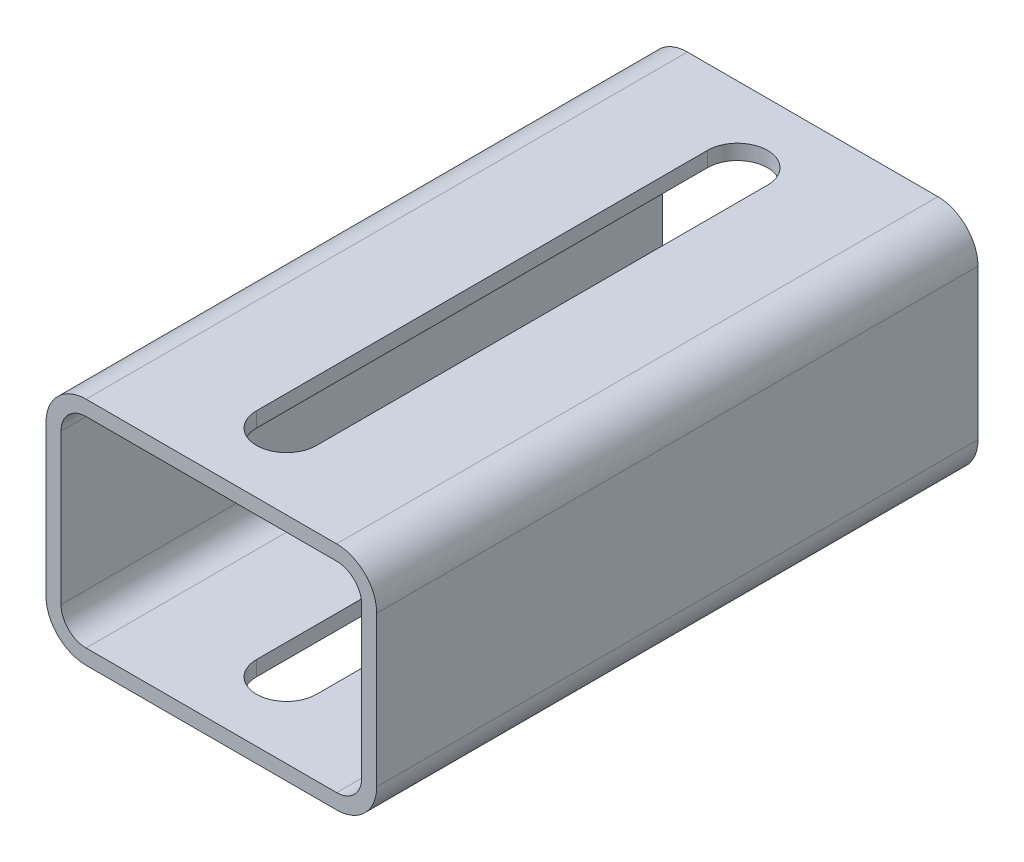
ISO-10303-21;
HEADER;
FILE_DESCRIPTION(('STEP AP214'),'2;1');
FILE_NAME('part.step','',(''),(''),'','','');
FILE_SCHEMA(('AUTOMOTIVE_DESIGN { 1 0 10303 214 1 1 1 1 }'));
ENDSEC;
DATA;
#1=APPLICATION_CONTEXT('core data for automotive mechanical design processes');
#2=APPLICATION_PROTOCOL_DEFINITION('international standard','automotive_design',2000,#1);
#3=PRODUCT_CONTEXT('',#1,'mechanical');
#4=PRODUCT('Part','Part','',(#3));
#5=PRODUCT_RELATED_PRODUCT_CATEGORY('part','',(#4));
#6=PRODUCT_DEFINITION_FORMATION('','',#4);
#7=PRODUCT_DEFINITION_CONTEXT('part definition',#1,'design');
#8=PRODUCT_DEFINITION('design','',#6,#7);
#9=PRODUCT_DEFINITION_SHAPE('','',#8);
#10=(LENGTH_UNIT() NAMED_UNIT(*) SI_UNIT(.MILLI.,.METRE.));
#11=(NAMED_UNIT(*) PLANE_ANGLE_UNIT() SI_UNIT($,.RADIAN.));
#12=(NAMED_UNIT(*) SI_UNIT($,.STERADIAN.) SOLID_ANGLE_UNIT());
#13=UNCERTAINTY_MEASURE_WITH_UNIT(LENGTH_MEASURE(1.E-05),#10,'distance_accuracy_value','');
#14=(GEOMETRIC_REPRESENTATION_CONTEXT(3) GLOBAL_UNCERTAINTY_ASSIGNED_CONTEXT((#13)) GLOBAL_UNIT_ASSIGNED_CONTEXT((#10,
#11,#12)) REPRESENTATION_CONTEXT('',''));
#15=CARTESIAN_POINT('',(0.,0.,0.));
#16=DIRECTION('',(0.,0.,1.));
#17=DIRECTION('',(1.,0.,0.));
#18=AXIS2_PLACEMENT_3D('',#15,#16,#17);
#19=CARTESIAN_POINT('',(25.,15.,60.));
#20=DIRECTION('',(0.,0.,-1.));
#21=DIRECTION('',(-1.,0.,0.));
#22=AXIS2_PLACEMENT_3D('',#19,#20,#21);
#23=PLANE('',#22);
#24=CARTESIAN_POINT('',(25.,15.,60.));
#25=DIRECTION('',(0.,0.,-1.));
#26=DIRECTION('',(-1.,0.,0.));
#27=AXIS2_PLACEMENT_3D('',#24,#25,#26);
#28=CIRCLE('',#27,8.);
#29=CARTESIAN_POINT('',(33.,15.,60.));
#30=VERTEX_POINT('',#29);
#31=CARTESIAN_POINT('',(25.,23.,60.));
#32=VERTEX_POINT('',#31);
#33=EDGE_CURVE('E404',#30,#32,#28,.F.);
#34=ORIENTED_EDGE('',*,*,#33,.T.);
#35=DIRECTION('',(-1.,0.,0.));
#36=VECTOR('',#35,1.);
#37=CARTESIAN_POINT('',(25.,23.,60.));
#38=LINE('',#37,#36);
#39=CARTESIAN_POINT('',(-25.,23.,60.));
#40=VERTEX_POINT('',#39);
#41=EDGE_CURVE('E408',#32,#40,#38,.T.);
#42=ORIENTED_EDGE('',*,*,#41,.T.);
#43=CARTESIAN_POINT('',(-25.,15.,60.));
#44=DIRECTION('',(0.,0.,-1.));
#45=DIRECTION('',(-1.,0.,0.));
#46=AXIS2_PLACEMENT_3D('',#43,#44,#45);
#47=CIRCLE('',#46,8.);
#48=CARTESIAN_POINT('',(-33.,14.9999999999999,60.));
#49=VERTEX_POINT('',#48);
#50=EDGE_CURVE('E412',#40,#49,#47,.F.);
#51=ORIENTED_EDGE('',*,*,#50,.T.);
#52=DIRECTION('',(0.,-1.,0.));
#53=VECTOR('',#52,1.);
#54=CARTESIAN_POINT('',(-33.,15.,60.));
#55=LINE('',#54,#53);
#56=CARTESIAN_POINT('',(-33.,-15.,60.));
#57=VERTEX_POINT('',#56);
#58=EDGE_CURVE('E415',#49,#57,#55,.T.);
#59=ORIENTED_EDGE('',*,*,#58,.T.);
#60=CARTESIAN_POINT('',(-25.,-15.,60.));
#61=DIRECTION('',(0.,0.,-1.));
#62=DIRECTION('',(-1.,0.,0.));
#63=AXIS2_PLACEMENT_3D('',#60,#61,#62);
#64=CIRCLE('',#63,8.);
#65=CARTESIAN_POINT('',(-24.9999999999999,-23.,60.));
#66=VERTEX_POINT('',#65);
#67=EDGE_CURVE('E418',#57,#66,#64,.F.);
#68=ORIENTED_EDGE('',*,*,#67,.T.);
#69=DIRECTION('',(1.,0.,0.));
#70=VECTOR('',#69,1.);
#71=CARTESIAN_POINT('',(25.,-23.,60.));
#72=LINE('',#71,#70);
#73=CARTESIAN_POINT('',(25.,-23.,60.));
#74=VERTEX_POINT('',#73);
#75=EDGE_CURVE('E421',#66,#74,#72,.T.);
#76=ORIENTED_EDGE('',*,*,#75,.T.);
#77=CARTESIAN_POINT('',(25.,-15.,60.));
#78=DIRECTION('',(0.,0.,-1.));
#79=DIRECTION('',(-1.,0.,0.));
#80=AXIS2_PLACEMENT_3D('',#77,#78,#79);
#81=CIRCLE('',#80,8.);
#82=CARTESIAN_POINT('',(33.,-15.,60.));
#83=VERTEX_POINT('',#82);
#84=EDGE_CURVE('E424',#74,#83,#81,.F.);
#85=ORIENTED_EDGE('',*,*,#84,.T.);
#86=DIRECTION('',(0.,1.,0.));
#87=VECTOR('',#86,1.);
#88=CARTESIAN_POINT('',(33.,15.,60.));
#89=LINE('',#88,#87);
#90=EDGE_CURVE('E427',#83,#30,#89,.T.);
#91=ORIENTED_EDGE('',*,*,#90,.T.);
#92=EDGE_LOOP('',(#34,#42,#51,#59,#68,#76,#85,#91));
#93=FACE_BOUND('',#92,.T.);
#94=CARTESIAN_POINT('',(25.,15.,60.));
#95=DIRECTION('',(0.,0.,1.));
#96=DIRECTION('',(-1.,0.,0.));
#97=AXIS2_PLACEMENT_3D('',#94,#95,#96);
#98=CIRCLE('',#97,5.);
#99=CARTESIAN_POINT('',(30.,15.,60.));
#100=VERTEX_POINT('',#99);
#101=CARTESIAN_POINT('',(25.,20.,60.));
#102=VERTEX_POINT('',#101);
#103=EDGE_CURVE('E321',#100,#102,#98,.T.);
#104=ORIENTED_EDGE('',*,*,#103,.F.);
#105=DIRECTION('',(0.,1.,0.));
#106=VECTOR('',#105,1.);
#107=CARTESIAN_POINT('',(30.,-15.,60.));
#108=LINE('',#107,#106);
#109=CARTESIAN_POINT('',(30.,-15.,60.));
#110=VERTEX_POINT('',#109);
#111=EDGE_CURVE('E344',#110,#100,#108,.T.);
#112=ORIENTED_EDGE('',*,*,#111,.F.);
#113=CARTESIAN_POINT('',(25.,-15.,60.));
#114=DIRECTION('',(0.,0.,1.));
#115=DIRECTION('',(1.,0.,0.));
#116=AXIS2_PLACEMENT_3D('',#113,#114,#115);
#117=CIRCLE('',#116,5.);
#118=CARTESIAN_POINT('',(25.,-20.,60.));
#119=VERTEX_POINT('',#118);
#120=EDGE_CURVE('E340',#119,#110,#117,.T.);
#121=ORIENTED_EDGE('',*,*,#120,.F.);
#122=DIRECTION('',(1.,0.,0.));
#123=VECTOR('',#122,1.);
#124=CARTESIAN_POINT('',(-25.,-20.,60.));
#125=LINE('',#124,#123);
#126=CARTESIAN_POINT('',(-25.,-20.,60.));
#127=VERTEX_POINT('',#126);
#128=EDGE_CURVE('E337',#127,#119,#125,.T.);
#129=ORIENTED_EDGE('',*,*,#128,.F.);
#130=CARTESIAN_POINT('',(-25.,-15.,60.));
#131=DIRECTION('',(0.,0.,1.));
#132=DIRECTION('',(-1.,0.,0.));
#133=AXIS2_PLACEMENT_3D('',#130,#131,#132);
#134=CIRCLE('',#133,5.);
#135=CARTESIAN_POINT('',(-30.,-15.,60.));
#136=VERTEX_POINT('',#135);
#137=EDGE_CURVE('E334',#136,#127,#134,.T.);
#138=ORIENTED_EDGE('',*,*,#137,.F.);
#139=DIRECTION('',(0.,-1.,0.));
#140=VECTOR('',#139,1.);
#141=CARTESIAN_POINT('',(-30.,-15.,60.));
#142=LINE('',#141,#140);
#143=CARTESIAN_POINT('',(-30.,15.,60.));
#144=VERTEX_POINT('',#143);
#145=EDGE_CURVE('E331',#144,#136,#142,.T.);
#146=ORIENTED_EDGE('',*,*,#145,.F.);
#147=CARTESIAN_POINT('',(-25.,15.,60.));
#148=DIRECTION('',(0.,0.,1.));
#149=DIRECTION('',(-1.,0.,0.));
#150=AXIS2_PLACEMENT_3D('',#147,#148,#149);
#151=CIRCLE('',#150,5.);
#152=CARTESIAN_POINT('',(-25.,20.,60.));
#153=VERTEX_POINT('',#152);
#154=EDGE_CURVE('E328',#153,#144,#151,.T.);
#155=ORIENTED_EDGE('',*,*,#154,.F.);
#156=DIRECTION('',(-1.,0.,0.));
#157=VECTOR('',#156,1.);
#158=CARTESIAN_POINT('',(-25.,20.,60.));
#159=LINE('',#158,#157);
#160=EDGE_CURVE('E324',#102,#153,#159,.T.);
#161=ORIENTED_EDGE('',*,*,#160,.F.);
#162=EDGE_LOOP('',(#104,#112,#121,#129,#138,#146,#155,#161));
#163=FACE_BOUND('',#162,.T.);
#164=ADVANCED_FACE('F87',(#93,#163),#23,.F.);
#165=CARTESIAN_POINT('',(25.,15.,-60.));
#166=DIRECTION('',(0.,0.,-1.));
#167=DIRECTION('',(-1.,0.,0.));
#168=AXIS2_PLACEMENT_3D('',#165,#166,#167);
#169=PLANE('',#168);
#170=CARTESIAN_POINT('',(25.,15.,-60.));
#171=DIRECTION('',(0.,0.,-1.));
#172=DIRECTION('',(-1.,0.,0.));
#173=AXIS2_PLACEMENT_3D('',#170,#171,#172);
#174=CIRCLE('',#173,8.);
#175=CARTESIAN_POINT('',(33.,15.,-60.));
#176=VERTEX_POINT('',#175);
#177=CARTESIAN_POINT('',(25.,23.,-60.));
#178=VERTEX_POINT('',#177);
#179=EDGE_CURVE('E403',#176,#178,#174,.F.);
#180=ORIENTED_EDGE('',*,*,#179,.F.);
#181=DIRECTION('',(0.,1.,0.));
#182=VECTOR('',#181,1.);
#183=CARTESIAN_POINT('',(33.,15.,-60.));
#184=LINE('',#183,#182);
#185=CARTESIAN_POINT('',(33.,-15.,-60.));
#186=VERTEX_POINT('',#185);
#187=EDGE_CURVE('E409',#186,#176,#184,.T.);
#188=ORIENTED_EDGE('',*,*,#187,.F.);
#189=CARTESIAN_POINT('',(25.,-15.,-60.));
#190=DIRECTION('',(0.,0.,-1.));
#191=DIRECTION('',(-1.,0.,0.));
#192=AXIS2_PLACEMENT_3D('',#189,#190,#191);
#193=CIRCLE('',#192,8.);
#194=CARTESIAN_POINT('',(25.,-23.,-60.));
#195=VERTEX_POINT('',#194);
#196=EDGE_CURVE('E449',#195,#186,#193,.F.);
#197=ORIENTED_EDGE('',*,*,#196,.F.);
#198=DIRECTION('',(1.,0.,0.));
#199=VECTOR('',#198,1.);
#200=CARTESIAN_POINT('',(25.,-23.,-60.));
#201=LINE('',#200,#199);
#202=CARTESIAN_POINT('',(-24.9999999999999,-23.,-60.));
#203=VERTEX_POINT('',#202);
#204=EDGE_CURVE('E446',#203,#195,#201,.T.);
#205=ORIENTED_EDGE('',*,*,#204,.F.);
#206=CARTESIAN_POINT('',(-25.,-15.,-60.));
#207=DIRECTION('',(0.,0.,-1.));
#208=DIRECTION('',(-1.,0.,0.));
#209=AXIS2_PLACEMENT_3D('',#206,#207,#208);
#210=CIRCLE('',#209,8.);
#211=CARTESIAN_POINT('',(-33.,-15.,-60.));
#212=VERTEX_POINT('',#211);
#213=EDGE_CURVE('E443',#212,#203,#210,.F.);
#214=ORIENTED_EDGE('',*,*,#213,.F.);
#215=DIRECTION('',(0.,-1.,0.));
#216=VECTOR('',#215,1.);
#217=CARTESIAN_POINT('',(-33.,15.,-60.));
#218=LINE('',#217,#216);
#219=CARTESIAN_POINT('',(-33.,14.9999999999999,-60.));
#220=VERTEX_POINT('',#219);
#221=EDGE_CURVE('E440',#220,#212,#218,.T.);
#222=ORIENTED_EDGE('',*,*,#221,.F.);
#223=CARTESIAN_POINT('',(-25.,15.,-60.));
#224=DIRECTION('',(0.,0.,-1.));
#225=DIRECTION('',(-1.,0.,0.));
#226=AXIS2_PLACEMENT_3D('',#223,#224,#225);
#227=CIRCLE('',#226,8.);
#228=CARTESIAN_POINT('',(-25.,23.,-60.));
#229=VERTEX_POINT('',#228);
#230=EDGE_CURVE('E437',#229,#220,#227,.F.);
#231=ORIENTED_EDGE('',*,*,#230,.F.);
#232=DIRECTION('',(-1.,0.,0.));
#233=VECTOR('',#232,1.);
#234=CARTESIAN_POINT('',(25.,23.,-60.));
#235=LINE('',#234,#233);
#236=EDGE_CURVE('E434',#178,#229,#235,.T.);
#237=ORIENTED_EDGE('',*,*,#236,.F.);
#238=EDGE_LOOP('',(#180,#188,#197,#205,#214,#222,#231,#237));
#239=FACE_BOUND('',#238,.T.);
#240=DIRECTION('',(0.,1.,0.));
#241=VECTOR('',#240,1.);
#242=CARTESIAN_POINT('',(30.,-15.,-60.));
#243=LINE('',#242,#241);
#244=CARTESIAN_POINT('',(30.,-15.,-60.));
#245=VERTEX_POINT('',#244);
#246=CARTESIAN_POINT('',(30.,15.,-60.));
#247=VERTEX_POINT('',#246);
#248=EDGE_CURVE('E325',#245,#247,#243,.T.);
#249=ORIENTED_EDGE('',*,*,#248,.T.);
#250=CARTESIAN_POINT('',(25.,15.,-60.));
#251=DIRECTION('',(0.,0.,1.));
#252=DIRECTION('',(-1.,0.,0.));
#253=AXIS2_PLACEMENT_3D('',#250,#251,#252);
#254=CIRCLE('',#253,5.);
#255=CARTESIAN_POINT('',(25.,20.,-60.));
#256=VERTEX_POINT('',#255);
#257=EDGE_CURVE('E320',#247,#256,#254,.T.);
#258=ORIENTED_EDGE('',*,*,#257,.T.);
#259=DIRECTION('',(-1.,0.,0.));
#260=VECTOR('',#259,1.);
#261=CARTESIAN_POINT('',(-25.,20.,-60.));
#262=LINE('',#261,#260);
#263=CARTESIAN_POINT('',(-25.,20.,-60.));
#264=VERTEX_POINT('',#263);
#265=EDGE_CURVE('E351',#256,#264,#262,.T.);
#266=ORIENTED_EDGE('',*,*,#265,.T.);
#267=CARTESIAN_POINT('',(-25.,15.,-60.));
#268=DIRECTION('',(0.,0.,1.));
#269=DIRECTION('',(-1.,0.,0.));
#270=AXIS2_PLACEMENT_3D('',#267,#268,#269);
#271=CIRCLE('',#270,5.);
#272=CARTESIAN_POINT('',(-30.,15.,-60.));
#273=VERTEX_POINT('',#272);
#274=EDGE_CURVE('E355',#264,#273,#271,.T.);
#275=ORIENTED_EDGE('',*,*,#274,.T.);
#276=DIRECTION('',(0.,-1.,0.));
#277=VECTOR('',#276,1.);
#278=CARTESIAN_POINT('',(-30.,-15.,-60.));
#279=LINE('',#278,#277);
#280=CARTESIAN_POINT('',(-30.,-15.,-60.));
#281=VERTEX_POINT('',#280);
#282=EDGE_CURVE('E359',#273,#281,#279,.T.);
#283=ORIENTED_EDGE('',*,*,#282,.T.);
#284=CARTESIAN_POINT('',(-25.,-15.,-60.));
#285=DIRECTION('',(0.,0.,1.));
#286=DIRECTION('',(-1.,0.,0.));
#287=AXIS2_PLACEMENT_3D('',#284,#285,#286);
#288=CIRCLE('',#287,5.);
#289=CARTESIAN_POINT('',(-25.,-20.,-60.));
#290=VERTEX_POINT('',#289);
#291=EDGE_CURVE('E363',#281,#290,#288,.T.);
#292=ORIENTED_EDGE('',*,*,#291,.T.);
#293=DIRECTION('',(1.,0.,0.));
#294=VECTOR('',#293,1.);
#295=CARTESIAN_POINT('',(-25.,-20.,-60.));
#296=LINE('',#295,#294);
#297=CARTESIAN_POINT('',(25.,-20.,-60.));
#298=VERTEX_POINT('',#297);
#299=EDGE_CURVE('E367',#290,#298,#296,.T.);
#300=ORIENTED_EDGE('',*,*,#299,.T.);
#301=CARTESIAN_POINT('',(25.,-15.,-60.));
#302=DIRECTION('',(0.,0.,1.));
#303=DIRECTION('',(1.,0.,0.));
#304=AXIS2_PLACEMENT_3D('',#301,#302,#303);
#305=CIRCLE('',#304,5.);
#306=EDGE_CURVE('E371',#298,#245,#305,.T.);
#307=ORIENTED_EDGE('',*,*,#306,.T.);
#308=EDGE_LOOP('',(#249,#258,#266,#275,#283,#292,#300,#307));
#309=FACE_BOUND('',#308,.T.);
#310=ADVANCED_FACE('F514',(#239,#309),#169,.T.);
#311=CARTESIAN_POINT('',(25.,15.,60.));
#312=DIRECTION('',(0.,0.,-1.));
#313=DIRECTION('',(-1.,0.,0.));
#314=AXIS2_PLACEMENT_3D('',#311,#312,#313);
#315=CYLINDRICAL_SURFACE('',#314,8.);
#316=ORIENTED_EDGE('',*,*,#179,.T.);
#317=DIRECTION('',(0.,0.,-1.));
#318=VECTOR('',#317,1.);
#319=CARTESIAN_POINT('',(25.,23.,60.));
#320=LINE('',#319,#318);
#321=EDGE_CURVE('E481',#32,#178,#320,.T.);
#322=ORIENTED_EDGE('',*,*,#321,.F.);
#323=ORIENTED_EDGE('',*,*,#33,.F.);
#324=DIRECTION('',(0.,0.,-1.));
#325=VECTOR('',#324,1.);
#326=CARTESIAN_POINT('',(33.,15.,60.));
#327=LINE('',#326,#325);
#328=EDGE_CURVE('E430',#30,#176,#327,.T.);
#329=ORIENTED_EDGE('',*,*,#328,.T.);
#330=EDGE_LOOP('',(#316,#322,#323,#329));
#331=FACE_BOUND('',#330,.T.);
#332=ADVANCED_FACE('F89',(#331),#315,.T.);
#333=CARTESIAN_POINT('',(25.,23.,60.));
#334=DIRECTION('',(0.,-1.,0.));
#335=DIRECTION('',(0.,0.,-1.));
#336=AXIS2_PLACEMENT_3D('',#333,#334,#335);
#337=PLANE('',#336);
#338=DIRECTION('',(0.,0.,1.));
#339=VECTOR('',#338,1.);
#340=CARTESIAN_POINT('',(-6.,23.,-45.));
#341=LINE('',#340,#339);
#342=CARTESIAN_POINT('',(-6.,23.,-45.));
#343=VERTEX_POINT('',#342);
#344=CARTESIAN_POINT('',(-5.99999999999999,23.,45.));
#345=VERTEX_POINT('',#344);
#346=EDGE_CURVE('E289',#343,#345,#341,.T.);
#347=ORIENTED_EDGE('',*,*,#346,.F.);
#348=CARTESIAN_POINT('',(0.,23.,-45.));
#349=DIRECTION('',(0.,1.,0.));
#350=DIRECTION('',(0.,0.,1.));
#351=AXIS2_PLACEMENT_3D('',#348,#349,#350);
#352=CIRCLE('',#351,6.);
#353=CARTESIAN_POINT('',(6.,23.,-45.));
#354=VERTEX_POINT('',#353);
#355=EDGE_CURVE('E103',#354,#343,#352,.T.);
#356=ORIENTED_EDGE('',*,*,#355,.F.);
#357=DIRECTION('',(0.,0.,-1.));
#358=VECTOR('',#357,1.);
#359=CARTESIAN_POINT('',(6.,23.,-45.));
#360=LINE('',#359,#358);
#361=CARTESIAN_POINT('',(6.00000000000001,23.,45.));
#362=VERTEX_POINT('',#361);
#363=EDGE_CURVE('E276',#362,#354,#360,.T.);
#364=ORIENTED_EDGE('',*,*,#363,.F.);
#365=CARTESIAN_POINT('',(0.,23.,45.));
#366=DIRECTION('',(0.,1.,0.));
#367=DIRECTION('',(0.,0.,1.));
#368=AXIS2_PLACEMENT_3D('',#365,#366,#367);
#369=CIRCLE('',#368,6.);
#370=EDGE_CURVE('E280',#345,#362,#369,.T.);
#371=ORIENTED_EDGE('',*,*,#370,.F.);
#372=EDGE_LOOP('',(#347,#356,#364,#371));
#373=FACE_BOUND('',#372,.T.);
#374=ORIENTED_EDGE('',*,*,#236,.T.);
#375=DIRECTION('',(0.,0.,-1.));
#376=VECTOR('',#375,1.);
#377=CARTESIAN_POINT('',(-25.,23.,60.));
#378=LINE('',#377,#376);
#379=EDGE_CURVE('E477',#40,#229,#378,.T.);
#380=ORIENTED_EDGE('',*,*,#379,.F.);
#381=ORIENTED_EDGE('',*,*,#41,.F.);
#382=ORIENTED_EDGE('',*,*,#321,.T.);
#383=EDGE_LOOP('',(#374,#380,#381,#382));
#384=FACE_BOUND('',#383,.T.);
#385=ADVANCED_FACE('F547',(#373,#384),#337,.F.);
#386=CARTESIAN_POINT('',(-25.,15.,60.));
#387=DIRECTION('',(0.,0.,-1.));
#388=DIRECTION('',(-1.,0.,0.));
#389=AXIS2_PLACEMENT_3D('',#386,#387,#388);
#390=CYLINDRICAL_SURFACE('',#389,8.);
#391=ORIENTED_EDGE('',*,*,#230,.T.);
#392=DIRECTION('',(0.,0.,-1.));
#393=VECTOR('',#392,1.);
#394=CARTESIAN_POINT('',(-33.,14.9999999999999,60.));
#395=LINE('',#394,#393);
#396=EDGE_CURVE('E473',#49,#220,#395,.T.);
#397=ORIENTED_EDGE('',*,*,#396,.F.);
#398=ORIENTED_EDGE('',*,*,#50,.F.);
#399=ORIENTED_EDGE('',*,*,#379,.T.);
#400=EDGE_LOOP('',(#391,#397,#398,#399));
#401=FACE_BOUND('',#400,.T.);
#402=ADVANCED_FACE('F544',(#401),#390,.T.);
#403=CARTESIAN_POINT('',(-33.,15.,60.));
#404=DIRECTION('',(1.,0.,0.));
#405=DIRECTION('',(0.,0.,-1.));
#406=AXIS2_PLACEMENT_3D('',#403,#404,#405);
#407=PLANE('',#406);
#408=ORIENTED_EDGE('',*,*,#221,.T.);
#409=DIRECTION('',(0.,0.,-1.));
#410=VECTOR('',#409,1.);
#411=CARTESIAN_POINT('',(-33.,-15.,60.));
#412=LINE('',#411,#410);
#413=EDGE_CURVE('E469',#57,#212,#412,.T.);
#414=ORIENTED_EDGE('',*,*,#413,.F.);
#415=ORIENTED_EDGE('',*,*,#58,.F.);
#416=ORIENTED_EDGE('',*,*,#396,.T.);
#417=EDGE_LOOP('',(#408,#414,#415,#416));
#418=FACE_BOUND('',#417,.T.);
#419=ADVANCED_FACE('F540',(#418),#407,.F.);
#420=CARTESIAN_POINT('',(-25.,-15.,60.));
#421=DIRECTION('',(0.,0.,-1.));
#422=DIRECTION('',(-1.,0.,0.));
#423=AXIS2_PLACEMENT_3D('',#420,#421,#422);
#424=CYLINDRICAL_SURFACE('',#423,8.);
#425=ORIENTED_EDGE('',*,*,#213,.T.);
#426=DIRECTION('',(0.,0.,-1.));
#427=VECTOR('',#426,1.);
#428=CARTESIAN_POINT('',(-24.9999999999999,-23.,60.));
#429=LINE('',#428,#427);
#430=EDGE_CURVE('E465',#66,#203,#429,.T.);
#431=ORIENTED_EDGE('',*,*,#430,.F.);
#432=ORIENTED_EDGE('',*,*,#67,.F.);
#433=ORIENTED_EDGE('',*,*,#413,.T.);
#434=EDGE_LOOP('',(#425,#431,#432,#433));
#435=FACE_BOUND('',#434,.T.);
#436=ADVANCED_FACE('F537',(#435),#424,.T.);
#437=CARTESIAN_POINT('',(25.,-23.,60.));
#438=DIRECTION('',(0.,1.,0.));
#439=DIRECTION('',(0.,0.,1.));
#440=AXIS2_PLACEMENT_3D('',#437,#438,#439);
#441=PLANE('',#440);
#442=DIRECTION('',(0.,0.,-1.));
#443=VECTOR('',#442,1.);
#444=CARTESIAN_POINT('',(6.,-23.,-45.));
#445=LINE('',#444,#443);
#446=CARTESIAN_POINT('',(6.00000000000001,-23.,45.));
#447=VERTEX_POINT('',#446);
#448=CARTESIAN_POINT('',(6.,-23.,-45.));
#449=VERTEX_POINT('',#448);
#450=EDGE_CURVE('E274',#447,#449,#445,.T.);
#451=ORIENTED_EDGE('',*,*,#450,.T.);
#452=CARTESIAN_POINT('',(0.,-23.,-45.));
#453=DIRECTION('',(0.,1.,0.));
#454=DIRECTION('',(0.,0.,1.));
#455=AXIS2_PLACEMENT_3D('',#452,#453,#454);
#456=CIRCLE('',#455,6.);
#457=CARTESIAN_POINT('',(-6.,-23.,-45.));
#458=VERTEX_POINT('',#457);
#459=EDGE_CURVE('E255',#449,#458,#456,.T.);
#460=ORIENTED_EDGE('',*,*,#459,.T.);
#461=DIRECTION('',(0.,0.,1.));
#462=VECTOR('',#461,1.);
#463=CARTESIAN_POINT('',(-6.,-23.,-45.));
#464=LINE('',#463,#462);
#465=CARTESIAN_POINT('',(-5.99999999999999,-23.,45.));
#466=VERTEX_POINT('',#465);
#467=EDGE_CURVE('E265',#458,#466,#464,.T.);
#468=ORIENTED_EDGE('',*,*,#467,.T.);
#469=CARTESIAN_POINT('',(0.,-23.,45.));
#470=DIRECTION('',(0.,1.,0.));
#471=DIRECTION('',(0.,0.,1.));
#472=AXIS2_PLACEMENT_3D('',#469,#470,#471);
#473=CIRCLE('',#472,6.);
#474=EDGE_CURVE('E111',#466,#447,#473,.T.);
#475=ORIENTED_EDGE('',*,*,#474,.T.);
#476=EDGE_LOOP('',(#451,#460,#468,#475));
#477=FACE_BOUND('',#476,.T.);
#478=ORIENTED_EDGE('',*,*,#204,.T.);
#479=DIRECTION('',(0.,0.,-1.));
#480=VECTOR('',#479,1.);
#481=CARTESIAN_POINT('',(25.,-23.,60.));
#482=LINE('',#481,#480);
#483=EDGE_CURVE('E461',#74,#195,#482,.T.);
#484=ORIENTED_EDGE('',*,*,#483,.F.);
#485=ORIENTED_EDGE('',*,*,#75,.F.);
#486=ORIENTED_EDGE('',*,*,#430,.T.);
#487=EDGE_LOOP('',(#478,#484,#485,#486));
#488=FACE_BOUND('',#487,.T.);
#489=ADVANCED_FACE('F271',(#477,#488),#441,.F.);
#490=CARTESIAN_POINT('',(25.,-15.,60.));
#491=DIRECTION('',(0.,0.,-1.));
#492=DIRECTION('',(-1.,0.,0.));
#493=AXIS2_PLACEMENT_3D('',#490,#491,#492);
#494=CYLINDRICAL_SURFACE('',#493,8.);
#495=ORIENTED_EDGE('',*,*,#196,.T.);
#496=DIRECTION('',(0.,0.,-1.));
#497=VECTOR('',#496,1.);
#498=CARTESIAN_POINT('',(33.,-15.,60.));
#499=LINE('',#498,#497);
#500=EDGE_CURVE('E457',#83,#186,#499,.T.);
#501=ORIENTED_EDGE('',*,*,#500,.F.);
#502=ORIENTED_EDGE('',*,*,#84,.F.);
#503=ORIENTED_EDGE('',*,*,#483,.T.);
#504=EDGE_LOOP('',(#495,#501,#502,#503));
#505=FACE_BOUND('',#504,.T.);
#506=ADVANCED_FACE('F530',(#505),#494,.T.);
#507=CARTESIAN_POINT('',(33.,15.,60.));
#508=DIRECTION('',(-1.,0.,0.));
#509=DIRECTION('',(0.,0.,1.));
#510=AXIS2_PLACEMENT_3D('',#507,#508,#509);
#511=PLANE('',#510);
#512=ORIENTED_EDGE('',*,*,#187,.T.);
#513=ORIENTED_EDGE('',*,*,#328,.F.);
#514=ORIENTED_EDGE('',*,*,#90,.F.);
#515=ORIENTED_EDGE('',*,*,#500,.T.);
#516=EDGE_LOOP('',(#512,#513,#514,#515));
#517=FACE_BOUND('',#516,.T.);
#518=ADVANCED_FACE('F527',(#517),#511,.F.);
#519=CARTESIAN_POINT('',(25.,15.,60.));
#520=DIRECTION('',(0.,0.,-1.));
#521=DIRECTION('',(-1.,0.,0.));
#522=AXIS2_PLACEMENT_3D('',#519,#520,#521);
#523=CYLINDRICAL_SURFACE('',#522,5.);
#524=ORIENTED_EDGE('',*,*,#257,.F.);
#525=DIRECTION('',(0.,0.,-1.));
#526=VECTOR('',#525,1.);
#527=CARTESIAN_POINT('',(30.,15.,60.));
#528=LINE('',#527,#526);
#529=EDGE_CURVE('E347',#100,#247,#528,.T.);
#530=ORIENTED_EDGE('',*,*,#529,.F.);
#531=ORIENTED_EDGE('',*,*,#103,.T.);
#532=DIRECTION('',(0.,0.,-1.));
#533=VECTOR('',#532,1.);
#534=CARTESIAN_POINT('',(25.,20.,60.));
#535=LINE('',#534,#533);
#536=EDGE_CURVE('E399',#102,#256,#535,.T.);
#537=ORIENTED_EDGE('',*,*,#536,.T.);
#538=EDGE_LOOP('',(#524,#530,#531,#537));
#539=FACE_BOUND('',#538,.T.);
#540=ADVANCED_FACE('F524',(#539),#523,.F.);
#541=CARTESIAN_POINT('',(-25.,20.,60.));
#542=DIRECTION('',(0.,-1.,0.));
#543=DIRECTION('',(0.,0.,-1.));
#544=AXIS2_PLACEMENT_3D('',#541,#542,#543);
#545=PLANE('',#544);
#546=CARTESIAN_POINT('',(0.,20.,-45.));
#547=DIRECTION('',(0.,-1.,0.));
#548=DIRECTION('',(0.,0.,-1.));
#549=AXIS2_PLACEMENT_3D('',#546,#547,#548);
#550=CIRCLE('',#549,6.);
#551=CARTESIAN_POINT('',(-6.,20.,-45.));
#552=VERTEX_POINT('',#551);
#553=CARTESIAN_POINT('',(6.,20.,-45.));
#554=VERTEX_POINT('',#553);
#555=EDGE_CURVE('E317',#552,#554,#550,.T.);
#556=ORIENTED_EDGE('',*,*,#555,.F.);
#557=DIRECTION('',(0.,0.,-1.));
#558=VECTOR('',#557,1.);
#559=CARTESIAN_POINT('',(-5.99999999999998,20.,60.));
#560=LINE('',#559,#558);
#561=CARTESIAN_POINT('',(-5.99999999999999,20.,45.));
#562=VERTEX_POINT('',#561);
#563=EDGE_CURVE('E299',#562,#552,#560,.T.);
#564=ORIENTED_EDGE('',*,*,#563,.F.);
#565=CARTESIAN_POINT('',(0.,20.,45.));
#566=DIRECTION('',(0.,-1.,0.));
#567=DIRECTION('',(0.,0.,-1.));
#568=AXIS2_PLACEMENT_3D('',#565,#566,#567);
#569=CIRCLE('',#568,6.);
#570=CARTESIAN_POINT('',(6.00000000000001,20.,45.));
#571=VERTEX_POINT('',#570);
#572=EDGE_CURVE('E310',#571,#562,#569,.T.);
#573=ORIENTED_EDGE('',*,*,#572,.F.);
#574=DIRECTION('',(0.,0.,1.));
#575=VECTOR('',#574,1.);
#576=CARTESIAN_POINT('',(6.00000000000002,20.,60.));
#577=LINE('',#576,#575);
#578=EDGE_CURVE('E314',#554,#571,#577,.T.);
#579=ORIENTED_EDGE('',*,*,#578,.F.);
#580=EDGE_LOOP('',(#556,#564,#573,#579));
#581=FACE_BOUND('',#580,.T.);
#582=ORIENTED_EDGE('',*,*,#265,.F.);
#583=ORIENTED_EDGE('',*,*,#536,.F.);
#584=ORIENTED_EDGE('',*,*,#160,.T.);
#585=DIRECTION('',(0.,0.,-1.));
#586=VECTOR('',#585,1.);
#587=CARTESIAN_POINT('',(-25.,20.,60.));
#588=LINE('',#587,#586);
#589=EDGE_CURVE('E396',#153,#264,#588,.T.);
#590=ORIENTED_EDGE('',*,*,#589,.T.);
#591=EDGE_LOOP('',(#582,#583,#584,#590));
#592=FACE_BOUND('',#591,.T.);
#593=ADVANCED_FACE('F595',(#581,#592),#545,.T.);
#594=CARTESIAN_POINT('',(-25.,15.,60.));
#595=DIRECTION('',(0.,0.,-1.));
#596=DIRECTION('',(-1.,0.,0.));
#597=AXIS2_PLACEMENT_3D('',#594,#595,#596);
#598=CYLINDRICAL_SURFACE('',#597,5.);
#599=ORIENTED_EDGE('',*,*,#274,.F.);
#600=ORIENTED_EDGE('',*,*,#589,.F.);
#601=ORIENTED_EDGE('',*,*,#154,.T.);
#602=DIRECTION('',(0.,0.,-1.));
#603=VECTOR('',#602,1.);
#604=CARTESIAN_POINT('',(-30.,15.,60.));
#605=LINE('',#604,#603);
#606=EDGE_CURVE('E393',#144,#273,#605,.T.);
#607=ORIENTED_EDGE('',*,*,#606,.T.);
#608=EDGE_LOOP('',(#599,#600,#601,#607));
#609=FACE_BOUND('',#608,.T.);
#610=ADVANCED_FACE('F598',(#609),#598,.F.);
#611=CARTESIAN_POINT('',(-30.,-15.,60.));
#612=DIRECTION('',(1.,0.,0.));
#613=DIRECTION('',(0.,0.,-1.));
#614=AXIS2_PLACEMENT_3D('',#611,#612,#613);
#615=PLANE('',#614);
#616=ORIENTED_EDGE('',*,*,#282,.F.);
#617=ORIENTED_EDGE('',*,*,#606,.F.);
#618=ORIENTED_EDGE('',*,*,#145,.T.);
#619=DIRECTION('',(0.,0.,-1.));
#620=VECTOR('',#619,1.);
#621=CARTESIAN_POINT('',(-30.,-15.,60.));
#622=LINE('',#621,#620);
#623=EDGE_CURVE('E390',#136,#281,#622,.T.);
#624=ORIENTED_EDGE('',*,*,#623,.T.);
#625=EDGE_LOOP('',(#616,#617,#618,#624));
#626=FACE_BOUND('',#625,.T.);
#627=ADVANCED_FACE('F603',(#626),#615,.T.);
#628=CARTESIAN_POINT('',(-25.,-15.,60.));
#629=DIRECTION('',(0.,0.,-1.));
#630=DIRECTION('',(-1.,0.,0.));
#631=AXIS2_PLACEMENT_3D('',#628,#629,#630);
#632=CYLINDRICAL_SURFACE('',#631,5.);
#633=ORIENTED_EDGE('',*,*,#291,.F.);
#634=ORIENTED_EDGE('',*,*,#623,.F.);
#635=ORIENTED_EDGE('',*,*,#137,.T.);
#636=DIRECTION('',(0.,0.,-1.));
#637=VECTOR('',#636,1.);
#638=CARTESIAN_POINT('',(-25.,-20.,60.));
#639=LINE('',#638,#637);
#640=EDGE_CURVE('E387',#127,#290,#639,.T.);
#641=ORIENTED_EDGE('',*,*,#640,.T.);
#642=EDGE_LOOP('',(#633,#634,#635,#641));
#643=FACE_BOUND('',#642,.T.);
#644=ADVANCED_FACE('F607',(#643),#632,.F.);
#645=CARTESIAN_POINT('',(-25.,-20.,60.));
#646=DIRECTION('',(0.,1.,0.));
#647=DIRECTION('',(0.,0.,1.));
#648=AXIS2_PLACEMENT_3D('',#645,#646,#647);
#649=PLANE('',#648);
#650=CARTESIAN_POINT('',(0.,-20.,-45.));
#651=DIRECTION('',(0.,1.,0.));
#652=DIRECTION('',(0.,0.,1.));
#653=AXIS2_PLACEMENT_3D('',#650,#651,#652);
#654=CIRCLE('',#653,6.);
#655=CARTESIAN_POINT('',(6.,-20.,-45.));
#656=VERTEX_POINT('',#655);
#657=CARTESIAN_POINT('',(-6.,-20.,-45.));
#658=VERTEX_POINT('',#657);
#659=EDGE_CURVE('E12',#656,#658,#654,.T.);
#660=ORIENTED_EDGE('',*,*,#659,.F.);
#661=DIRECTION('',(0.,0.,-1.));
#662=VECTOR('',#661,1.);
#663=CARTESIAN_POINT('',(6.00000000000002,-20.,60.));
#664=LINE('',#663,#662);
#665=CARTESIAN_POINT('',(6.00000000000001,-20.,45.));
#666=VERTEX_POINT('',#665);
#667=EDGE_CURVE('E96',#666,#656,#664,.T.);
#668=ORIENTED_EDGE('',*,*,#667,.F.);
#669=CARTESIAN_POINT('',(0.,-20.,45.));
#670=DIRECTION('',(0.,1.,0.));
#671=DIRECTION('',(0.,0.,1.));
#672=AXIS2_PLACEMENT_3D('',#669,#670,#671);
#673=CIRCLE('',#672,6.);
#674=CARTESIAN_POINT('',(-5.99999999999999,-20.,45.));
#675=VERTEX_POINT('',#674);
#676=EDGE_CURVE('E488',#675,#666,#673,.T.);
#677=ORIENTED_EDGE('',*,*,#676,.F.);
#678=DIRECTION('',(0.,0.,1.));
#679=VECTOR('',#678,1.);
#680=CARTESIAN_POINT('',(-5.99999999999998,-20.,60.));
#681=LINE('',#680,#679);
#682=EDGE_CURVE('E485',#658,#675,#681,.T.);
#683=ORIENTED_EDGE('',*,*,#682,.F.);
#684=EDGE_LOOP('',(#660,#668,#677,#683));
#685=FACE_BOUND('',#684,.T.);
#686=ORIENTED_EDGE('',*,*,#299,.F.);
#687=ORIENTED_EDGE('',*,*,#640,.F.);
#688=ORIENTED_EDGE('',*,*,#128,.T.);
#689=DIRECTION('',(0.,0.,-1.));
#690=VECTOR('',#689,1.);
#691=CARTESIAN_POINT('',(25.,-20.,60.));
#692=LINE('',#691,#690);
#693=EDGE_CURVE('E384',#119,#298,#692,.T.);
#694=ORIENTED_EDGE('',*,*,#693,.T.);
#695=EDGE_LOOP('',(#686,#687,#688,#694));
#696=FACE_BOUND('',#695,.T.);
#697=ADVANCED_FACE('F496',(#685,#696),#649,.T.);
#698=CARTESIAN_POINT('',(25.,-15.,60.));
#699=DIRECTION('',(0.,0.,-1.));
#700=DIRECTION('',(-1.,0.,0.));
#701=AXIS2_PLACEMENT_3D('',#698,#699,#700);
#702=CYLINDRICAL_SURFACE('',#701,5.);
#703=ORIENTED_EDGE('',*,*,#306,.F.);
#704=ORIENTED_EDGE('',*,*,#693,.F.);
#705=ORIENTED_EDGE('',*,*,#120,.T.);
#706=DIRECTION('',(0.,0.,-1.));
#707=VECTOR('',#706,1.);
#708=CARTESIAN_POINT('',(30.,-15.,60.));
#709=LINE('',#708,#707);
#710=EDGE_CURVE('E381',#110,#245,#709,.T.);
#711=ORIENTED_EDGE('',*,*,#710,.T.);
#712=EDGE_LOOP('',(#703,#704,#705,#711));
#713=FACE_BOUND('',#712,.T.);
#714=ADVANCED_FACE('F613',(#713),#702,.F.);
#715=CARTESIAN_POINT('',(30.,-15.,60.));
#716=DIRECTION('',(-1.,0.,0.));
#717=DIRECTION('',(0.,0.,1.));
#718=AXIS2_PLACEMENT_3D('',#715,#716,#717);
#719=PLANE('',#718);
#720=ORIENTED_EDGE('',*,*,#248,.F.);
#721=ORIENTED_EDGE('',*,*,#710,.F.);
#722=ORIENTED_EDGE('',*,*,#111,.T.);
#723=ORIENTED_EDGE('',*,*,#529,.T.);
#724=EDGE_LOOP('',(#720,#721,#722,#723));
#725=FACE_BOUND('',#724,.T.);
#726=ADVANCED_FACE('F508',(#725),#719,.T.);
#727=CARTESIAN_POINT('',(-6.,-23.,-45.));
#728=DIRECTION('',(-1.,0.,0.));
#729=DIRECTION('',(0.,0.,1.));
#730=AXIS2_PLACEMENT_3D('',#727,#728,#729);
#731=PLANE('',#730);
#732=ORIENTED_EDGE('',*,*,#682,.T.);
#733=DIRECTION('',(0.,1.,0.));
#734=VECTOR('',#733,1.);
#735=CARTESIAN_POINT('',(-5.99999999999999,-23.,45.));
#736=LINE('',#735,#734);
#737=EDGE_CURVE('E267',#466,#675,#736,.T.);
#738=ORIENTED_EDGE('',*,*,#737,.F.);
#739=ORIENTED_EDGE('',*,*,#467,.F.);
#740=DIRECTION('',(0.,1.,0.));
#741=VECTOR('',#740,1.);
#742=CARTESIAN_POINT('',(-6.,-23.,-45.));
#743=LINE('',#742,#741);
#744=EDGE_CURVE('E250',#458,#658,#743,.T.);
#745=ORIENTED_EDGE('',*,*,#744,.T.);
#746=EDGE_LOOP('',(#732,#738,#739,#745));
#747=FACE_BOUND('',#746,.T.);
#748=ADVANCED_FACE('F266',(#747),#731,.F.);
#749=CARTESIAN_POINT('',(0.,-23.,45.));
#750=DIRECTION('',(0.,1.,0.));
#751=DIRECTION('',(0.,0.,1.));
#752=AXIS2_PLACEMENT_3D('',#749,#750,#751);
#753=CYLINDRICAL_SURFACE('',#752,6.);
#754=ORIENTED_EDGE('',*,*,#676,.T.);
#755=DIRECTION('',(0.,1.,0.));
#756=VECTOR('',#755,1.);
#757=CARTESIAN_POINT('',(6.00000000000001,-23.,45.));
#758=LINE('',#757,#756);
#759=EDGE_CURVE('E301',#447,#666,#758,.T.);
#760=ORIENTED_EDGE('',*,*,#759,.F.);
#761=ORIENTED_EDGE('',*,*,#474,.F.);
#762=ORIENTED_EDGE('',*,*,#737,.T.);
#763=EDGE_LOOP('',(#754,#760,#761,#762));
#764=FACE_BOUND('',#763,.T.);
#765=ADVANCED_FACE('F498',(#764),#753,.F.);
#766=CARTESIAN_POINT('',(6.,-23.,-45.));
#767=DIRECTION('',(1.,0.,0.));
#768=DIRECTION('',(0.,0.,-1.));
#769=AXIS2_PLACEMENT_3D('',#766,#767,#768);
#770=PLANE('',#769);
#771=ORIENTED_EDGE('',*,*,#667,.T.);
#772=DIRECTION('',(0.,1.,0.));
#773=VECTOR('',#772,1.);
#774=CARTESIAN_POINT('',(6.,-23.,-45.));
#775=LINE('',#774,#773);
#776=EDGE_CURVE('E296',#449,#656,#775,.T.);
#777=ORIENTED_EDGE('',*,*,#776,.F.);
#778=ORIENTED_EDGE('',*,*,#450,.F.);
#779=ORIENTED_EDGE('',*,*,#759,.T.);
#780=EDGE_LOOP('',(#771,#777,#778,#779));
#781=FACE_BOUND('',#780,.T.);
#782=ADVANCED_FACE('F493',(#781),#770,.F.);
#783=CARTESIAN_POINT('',(0.,-23.,-45.));
#784=DIRECTION('',(0.,1.,0.));
#785=DIRECTION('',(0.,0.,1.));
#786=AXIS2_PLACEMENT_3D('',#783,#784,#785);
#787=CYLINDRICAL_SURFACE('',#786,6.);
#788=ORIENTED_EDGE('',*,*,#659,.T.);
#789=ORIENTED_EDGE('',*,*,#744,.F.);
#790=ORIENTED_EDGE('',*,*,#459,.F.);
#791=ORIENTED_EDGE('',*,*,#776,.T.);
#792=EDGE_LOOP('',(#788,#789,#790,#791));
#793=FACE_BOUND('',#792,.T.);
#794=ADVANCED_FACE('F252',(#793),#787,.F.);
#795=ORIENTED_EDGE('',*,*,#555,.T.);
#796=EDGE_CURVE('E300',#554,#354,#775,.T.);
#797=ORIENTED_EDGE('',*,*,#796,.T.);
#798=ORIENTED_EDGE('',*,*,#355,.T.);
#799=EDGE_CURVE('E262',#552,#343,#743,.T.);
#800=ORIENTED_EDGE('',*,*,#799,.F.);
#801=EDGE_LOOP('',(#795,#797,#798,#800));
#802=FACE_BOUND('',#801,.T.);
#803=ADVANCED_FACE('F639',(#802),#787,.F.);
#804=ORIENTED_EDGE('',*,*,#578,.T.);
#805=EDGE_CURVE('E305',#571,#362,#758,.T.);
#806=ORIENTED_EDGE('',*,*,#805,.T.);
#807=ORIENTED_EDGE('',*,*,#363,.T.);
#808=ORIENTED_EDGE('',*,*,#796,.F.);
#809=EDGE_LOOP('',(#804,#806,#807,#808));
#810=FACE_BOUND('',#809,.T.);
#811=ADVANCED_FACE('F507',(#810),#770,.F.);
#812=ORIENTED_EDGE('',*,*,#572,.T.);
#813=EDGE_CURVE('E261',#562,#345,#736,.T.);
#814=ORIENTED_EDGE('',*,*,#813,.T.);
#815=ORIENTED_EDGE('',*,*,#370,.T.);
#816=ORIENTED_EDGE('',*,*,#805,.F.);
#817=EDGE_LOOP('',(#812,#814,#815,#816));
#818=FACE_BOUND('',#817,.T.);
#819=ADVANCED_FACE('F501',(#818),#753,.F.);
#820=ORIENTED_EDGE('',*,*,#563,.T.);
#821=ORIENTED_EDGE('',*,*,#799,.T.);
#822=ORIENTED_EDGE('',*,*,#346,.T.);
#823=ORIENTED_EDGE('',*,*,#813,.F.);
#824=EDGE_LOOP('',(#820,#821,#822,#823));
#825=FACE_BOUND('',#824,.T.);
#826=ADVANCED_FACE('F510',(#825),#731,.F.);
#827=CLOSED_SHELL('',(#164,#310,#332,#385,#402,#419,#436,#489,#506,#518,#540,#593,#610,#627,
#644,#697,#714,#726,#748,#765,#782,#794,#803,#811,#819,#826));
#828=MANIFOLD_SOLID_BREP('B2',#827);
#829=ADVANCED_BREP_SHAPE_REPRESENTATION('',(#18,#828),#14);
#830=SHAPE_DEFINITION_REPRESENTATION(#9,#829);
ENDSEC;
END-ISO-10303-21;
